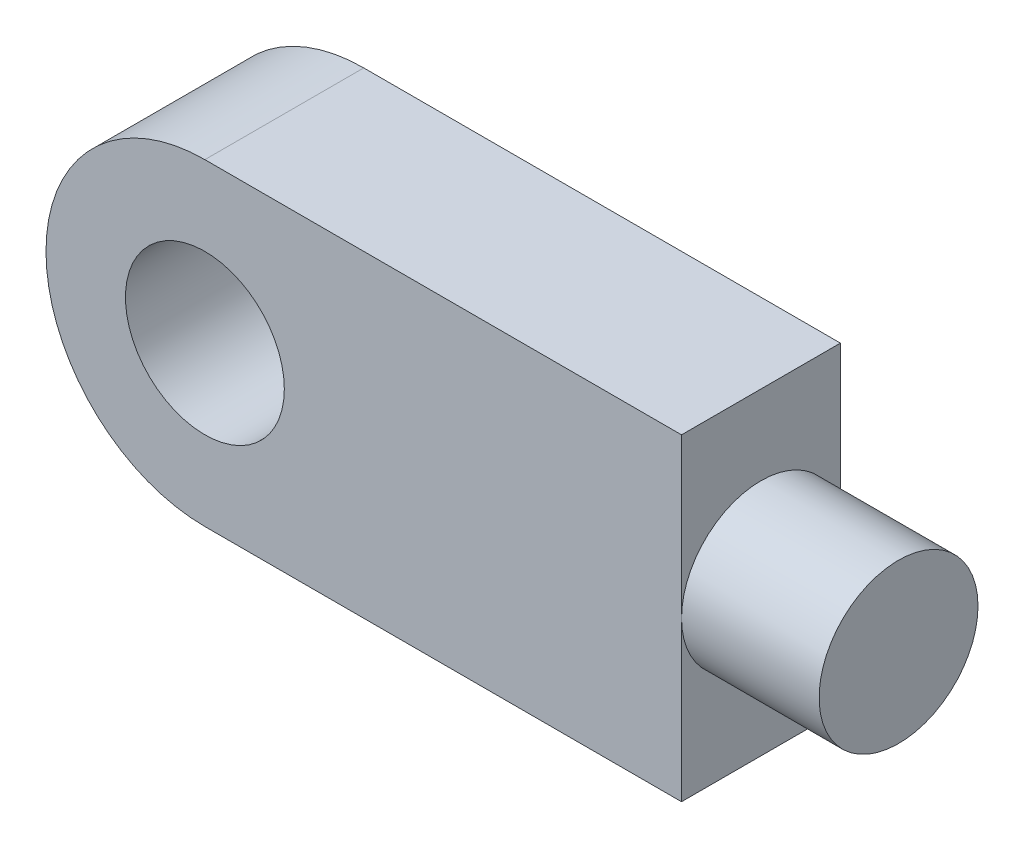
ISO-10303-21;
HEADER;
FILE_DESCRIPTION(('STEP AP214'),'2;1');
FILE_NAME('part.step','',(''),(''),'','','');
FILE_SCHEMA(('AUTOMOTIVE_DESIGN { 1 0 10303 214 1 1 1 1 }'));
ENDSEC;
DATA;
#1=APPLICATION_CONTEXT('core data for automotive mechanical design processes');
#2=APPLICATION_PROTOCOL_DEFINITION('international standard','automotive_design',2000,#1);
#3=PRODUCT_CONTEXT('',#1,'mechanical');
#4=PRODUCT('Part','Part','',(#3));
#5=PRODUCT_RELATED_PRODUCT_CATEGORY('part','',(#4));
#6=PRODUCT_DEFINITION_FORMATION('','',#4);
#7=PRODUCT_DEFINITION_CONTEXT('part definition',#1,'design');
#8=PRODUCT_DEFINITION('design','',#6,#7);
#9=PRODUCT_DEFINITION_SHAPE('','',#8);
#10=(LENGTH_UNIT() NAMED_UNIT(*) SI_UNIT(.MILLI.,.METRE.));
#11=(NAMED_UNIT(*) PLANE_ANGLE_UNIT() SI_UNIT($,.RADIAN.));
#12=(NAMED_UNIT(*) SI_UNIT($,.STERADIAN.) SOLID_ANGLE_UNIT());
#13=UNCERTAINTY_MEASURE_WITH_UNIT(LENGTH_MEASURE(1.E-05),#10,'distance_accuracy_value','');
#14=(GEOMETRIC_REPRESENTATION_CONTEXT(3) GLOBAL_UNCERTAINTY_ASSIGNED_CONTEXT((#13)) GLOBAL_UNIT_ASSIGNED_CONTEXT((#10,
#11,#12)) REPRESENTATION_CONTEXT('',''));
#15=CARTESIAN_POINT('',(0.,0.,0.));
#16=DIRECTION('',(0.,0.,1.));
#17=DIRECTION('',(1.,0.,0.));
#18=AXIS2_PLACEMENT_3D('',#15,#16,#17);
#19=CARTESIAN_POINT('',(125.,0.,0.));
#20=DIRECTION('',(-1.,0.,0.));
#21=DIRECTION('',(0.,0.,1.));
#22=AXIS2_PLACEMENT_3D('',#19,#20,#21);
#23=CYLINDRICAL_SURFACE('',#22,25.);
#24=CARTESIAN_POINT('',(75.,0.,0.));
#25=DIRECTION('',(1.,0.,0.));
#26=DIRECTION('',(0.,0.,-1.));
#27=AXIS2_PLACEMENT_3D('',#24,#25,#26);
#28=CIRCLE('',#27,25.);
#29=CARTESIAN_POINT('',(75.,0.,-25.));
#30=VERTEX_POINT('',#29);
#31=CARTESIAN_POINT('',(75.,0.,25.));
#32=VERTEX_POINT('',#31);
#33=EDGE_CURVE('E145',#30,#32,#28,.T.);
#34=ORIENTED_EDGE('',*,*,#33,.T.);
#35=CARTESIAN_POINT('',(75.,0.,0.));
#36=DIRECTION('',(1.,0.,0.));
#37=DIRECTION('',(0.,0.,-1.));
#38=AXIS2_PLACEMENT_3D('',#35,#36,#37);
#39=CIRCLE('',#38,25.);
#40=EDGE_CURVE('E161',#32,#30,#39,.T.);
#41=ORIENTED_EDGE('',*,*,#40,.T.);
#42=EDGE_LOOP('',(#34,#41));
#43=FACE_BOUND('',#42,.T.);
#44=CARTESIAN_POINT('',(118.301270189222,0.,0.));
#45=DIRECTION('',(1.,0.,0.));
#46=DIRECTION('',(0.,0.,-1.));
#47=AXIS2_PLACEMENT_3D('',#44,#45,#46);
#48=CIRCLE('',#47,25.);
#49=CARTESIAN_POINT('',(118.301270189222,0.,-25.));
#50=VERTEX_POINT('',#49);
#51=EDGE_CURVE('E163',#50,#50,#48,.F.);
#52=ORIENTED_EDGE('',*,*,#51,.T.);
#53=EDGE_LOOP('',(#52));
#54=FACE_BOUND('',#53,.T.);
#55=ADVANCED_FACE('F63',(#43,#54),#23,.T.);
#56=CARTESIAN_POINT('',(-75.,0.,25.));
#57=DIRECTION('',(0.,0.,1.));
#58=DIRECTION('',(1.,0.,0.));
#59=AXIS2_PLACEMENT_3D('',#56,#57,#58);
#60=PLANE('',#59);
#61=CARTESIAN_POINT('',(-75.,0.,25.));
#62=DIRECTION('',(0.,0.,1.));
#63=DIRECTION('',(1.,0.,0.));
#64=AXIS2_PLACEMENT_3D('',#61,#62,#63);
#65=CIRCLE('',#64,25.);
#66=CARTESIAN_POINT('',(-50.,0.,25.));
#67=VERTEX_POINT('',#66);
#68=EDGE_CURVE('E119',#67,#67,#65,.T.);
#69=ORIENTED_EDGE('',*,*,#68,.F.);
#70=EDGE_LOOP('',(#69));
#71=FACE_BOUND('',#70,.T.);
#72=DIRECTION('',(1.,0.,0.));
#73=VECTOR('',#72,1.);
#74=CARTESIAN_POINT('',(-75.,-50.,25.));
#75=LINE('',#74,#73);
#76=CARTESIAN_POINT('',(-75.,-50.,25.));
#77=VERTEX_POINT('',#76);
#78=CARTESIAN_POINT('',(75.,-50.,25.));
#79=VERTEX_POINT('',#78);
#80=EDGE_CURVE('E148',#77,#79,#75,.T.);
#81=ORIENTED_EDGE('',*,*,#80,.T.);
#82=DIRECTION('',(0.,-1.,0.));
#83=VECTOR('',#82,1.);
#84=CARTESIAN_POINT('',(75.,0.,25.));
#85=LINE('',#84,#83);
#86=EDGE_CURVE('E141',#32,#79,#85,.T.);
#87=ORIENTED_EDGE('',*,*,#86,.F.);
#88=DIRECTION('',(0.,-1.,0.));
#89=VECTOR('',#88,1.);
#90=CARTESIAN_POINT('',(75.,0.,25.));
#91=LINE('',#90,#89);
#92=CARTESIAN_POINT('',(75.,50.,25.));
#93=VERTEX_POINT('',#92);
#94=EDGE_CURVE('E153',#93,#32,#91,.T.);
#95=ORIENTED_EDGE('',*,*,#94,.F.);
#96=DIRECTION('',(-1.,0.,0.));
#97=VECTOR('',#96,1.);
#98=CARTESIAN_POINT('',(-75.,50.,25.));
#99=LINE('',#98,#97);
#100=CARTESIAN_POINT('',(-75.,50.,25.));
#101=VERTEX_POINT('',#100);
#102=EDGE_CURVE('E80',#93,#101,#99,.T.);
#103=ORIENTED_EDGE('',*,*,#102,.T.);
#104=CARTESIAN_POINT('',(-75.,0.,25.));
#105=DIRECTION('',(0.,0.,1.));
#106=DIRECTION('',(1.,0.,0.));
#107=AXIS2_PLACEMENT_3D('',#104,#105,#106);
#108=CIRCLE('',#107,50.);
#109=EDGE_CURVE('E108',#101,#77,#108,.T.);
#110=ORIENTED_EDGE('',*,*,#109,.T.);
#111=EDGE_LOOP('',(#81,#87,#95,#103,#110));
#112=FACE_BOUND('',#111,.T.);
#113=ADVANCED_FACE('F149',(#71,#112),#60,.T.);
#114=CARTESIAN_POINT('',(-75.,0.,-25.));
#115=DIRECTION('',(0.,0.,1.));
#116=DIRECTION('',(1.,0.,0.));
#117=AXIS2_PLACEMENT_3D('',#114,#115,#116);
#118=PLANE('',#117);
#119=CARTESIAN_POINT('',(-75.,0.,-25.));
#120=DIRECTION('',(0.,0.,1.));
#121=DIRECTION('',(1.,0.,0.));
#122=AXIS2_PLACEMENT_3D('',#119,#120,#121);
#123=CIRCLE('',#122,25.);
#124=CARTESIAN_POINT('',(-50.,0.,-25.));
#125=VERTEX_POINT('',#124);
#126=EDGE_CURVE('E123',#125,#125,#123,.T.);
#127=ORIENTED_EDGE('',*,*,#126,.T.);
#128=EDGE_LOOP('',(#127));
#129=FACE_BOUND('',#128,.T.);
#130=DIRECTION('',(0.,-1.,0.));
#131=VECTOR('',#130,1.);
#132=CARTESIAN_POINT('',(75.,0.,-25.));
#133=LINE('',#132,#131);
#134=CARTESIAN_POINT('',(75.,-50.,-25.));
#135=VERTEX_POINT('',#134);
#136=EDGE_CURVE('E137',#30,#135,#133,.T.);
#137=ORIENTED_EDGE('',*,*,#136,.T.);
#138=DIRECTION('',(1.,0.,0.));
#139=VECTOR('',#138,1.);
#140=CARTESIAN_POINT('',(-75.,-50.,-25.));
#141=LINE('',#140,#139);
#142=CARTESIAN_POINT('',(-75.,-50.,-25.));
#143=VERTEX_POINT('',#142);
#144=EDGE_CURVE('E109',#143,#135,#141,.T.);
#145=ORIENTED_EDGE('',*,*,#144,.F.);
#146=CARTESIAN_POINT('',(-75.,0.,-25.));
#147=DIRECTION('',(0.,0.,1.));
#148=DIRECTION('',(1.,0.,0.));
#149=AXIS2_PLACEMENT_3D('',#146,#147,#148);
#150=CIRCLE('',#149,50.);
#151=CARTESIAN_POINT('',(-75.,50.,-25.));
#152=VERTEX_POINT('',#151);
#153=EDGE_CURVE('E114',#152,#143,#150,.T.);
#154=ORIENTED_EDGE('',*,*,#153,.F.);
#155=DIRECTION('',(-1.,0.,0.));
#156=VECTOR('',#155,1.);
#157=CARTESIAN_POINT('',(-75.,50.,-25.));
#158=LINE('',#157,#156);
#159=CARTESIAN_POINT('',(75.,50.,-25.));
#160=VERTEX_POINT('',#159);
#161=EDGE_CURVE('E100',#160,#152,#158,.T.);
#162=ORIENTED_EDGE('',*,*,#161,.F.);
#163=DIRECTION('',(0.,-1.,0.));
#164=VECTOR('',#163,1.);
#165=CARTESIAN_POINT('',(75.,0.,-25.));
#166=LINE('',#165,#164);
#167=EDGE_CURVE('E95',#160,#30,#166,.T.);
#168=ORIENTED_EDGE('',*,*,#167,.T.);
#169=EDGE_LOOP('',(#137,#145,#154,#162,#168));
#170=FACE_BOUND('',#169,.T.);
#171=ADVANCED_FACE('F117',(#129,#170),#118,.F.);
#172=CARTESIAN_POINT('',(-75.,0.,25.));
#173=DIRECTION('',(0.,0.,-1.));
#174=DIRECTION('',(-1.,0.,0.));
#175=AXIS2_PLACEMENT_3D('',#172,#173,#174);
#176=CYLINDRICAL_SURFACE('',#175,50.);
#177=ORIENTED_EDGE('',*,*,#153,.T.);
#178=DIRECTION('',(0.,0.,-1.));
#179=VECTOR('',#178,1.);
#180=CARTESIAN_POINT('',(-75.,-50.,25.));
#181=LINE('',#180,#179);
#182=EDGE_CURVE('E12',#77,#143,#181,.T.);
#183=ORIENTED_EDGE('',*,*,#182,.F.);
#184=ORIENTED_EDGE('',*,*,#109,.F.);
#185=DIRECTION('',(0.,0.,-1.));
#186=VECTOR('',#185,1.);
#187=CARTESIAN_POINT('',(-75.,50.,25.));
#188=LINE('',#187,#186);
#189=EDGE_CURVE('E103',#101,#152,#188,.T.);
#190=ORIENTED_EDGE('',*,*,#189,.T.);
#191=EDGE_LOOP('',(#177,#183,#184,#190));
#192=FACE_BOUND('',#191,.T.);
#193=ADVANCED_FACE('F65',(#192),#176,.T.);
#194=CARTESIAN_POINT('',(-75.,-50.,25.));
#195=DIRECTION('',(0.,1.,0.));
#196=DIRECTION('',(-1.,0.,0.));
#197=AXIS2_PLACEMENT_3D('',#194,#195,#196);
#198=PLANE('',#197);
#199=ORIENTED_EDGE('',*,*,#144,.T.);
#200=DIRECTION('',(0.,0.,-1.));
#201=VECTOR('',#200,1.);
#202=CARTESIAN_POINT('',(75.,-50.,25.));
#203=LINE('',#202,#201);
#204=EDGE_CURVE('E72',#79,#135,#203,.T.);
#205=ORIENTED_EDGE('',*,*,#204,.F.);
#206=ORIENTED_EDGE('',*,*,#80,.F.);
#207=ORIENTED_EDGE('',*,*,#182,.T.);
#208=EDGE_LOOP('',(#199,#205,#206,#207));
#209=FACE_BOUND('',#208,.T.);
#210=ADVANCED_FACE('F147',(#209),#198,.F.);
#211=CARTESIAN_POINT('',(-75.,50.,25.));
#212=DIRECTION('',(0.,-1.,0.));
#213=DIRECTION('',(1.,0.,0.));
#214=AXIS2_PLACEMENT_3D('',#211,#212,#213);
#215=PLANE('',#214);
#216=ORIENTED_EDGE('',*,*,#161,.T.);
#217=ORIENTED_EDGE('',*,*,#189,.F.);
#218=ORIENTED_EDGE('',*,*,#102,.F.);
#219=DIRECTION('',(0.,0.,-1.));
#220=VECTOR('',#219,1.);
#221=CARTESIAN_POINT('',(75.,50.,25.));
#222=LINE('',#221,#220);
#223=EDGE_CURVE('E105',#93,#160,#222,.T.);
#224=ORIENTED_EDGE('',*,*,#223,.T.);
#225=EDGE_LOOP('',(#216,#217,#218,#224));
#226=FACE_BOUND('',#225,.T.);
#227=ADVANCED_FACE('F102',(#226),#215,.F.);
#228=CARTESIAN_POINT('',(-75.,0.,25.));
#229=DIRECTION('',(0.,0.,-1.));
#230=DIRECTION('',(-1.,0.,0.));
#231=AXIS2_PLACEMENT_3D('',#228,#229,#230);
#232=CYLINDRICAL_SURFACE('',#231,25.);
#233=ORIENTED_EDGE('',*,*,#68,.T.);
#234=EDGE_LOOP('',(#233));
#235=FACE_BOUND('',#234,.T.);
#236=ORIENTED_EDGE('',*,*,#126,.F.);
#237=EDGE_LOOP('',(#236));
#238=FACE_BOUND('',#237,.T.);
#239=ADVANCED_FACE('F186',(#235,#238),#232,.F.);
#240=CARTESIAN_POINT('',(75.,0.,0.));
#241=DIRECTION('',(1.,0.,0.));
#242=DIRECTION('',(0.,0.,-1.));
#243=AXIS2_PLACEMENT_3D('',#240,#241,#242);
#244=PLANE('',#243);
#245=ORIENTED_EDGE('',*,*,#33,.F.);
#246=ORIENTED_EDGE('',*,*,#167,.F.);
#247=ORIENTED_EDGE('',*,*,#223,.F.);
#248=ORIENTED_EDGE('',*,*,#94,.T.);
#249=EDGE_LOOP('',(#245,#246,#247,#248));
#250=FACE_BOUND('',#249,.T.);
#251=ADVANCED_FACE('F174',(#250),#244,.T.);
#252=CARTESIAN_POINT('',(75.,0.,0.));
#253=DIRECTION('',(1.,0.,0.));
#254=DIRECTION('',(0.,0.,-1.));
#255=AXIS2_PLACEMENT_3D('',#252,#253,#254);
#256=PLANE('',#255);
#257=ORIENTED_EDGE('',*,*,#40,.F.);
#258=ORIENTED_EDGE('',*,*,#86,.T.);
#259=ORIENTED_EDGE('',*,*,#204,.T.);
#260=ORIENTED_EDGE('',*,*,#136,.F.);
#261=EDGE_LOOP('',(#257,#258,#259,#260));
#262=FACE_BOUND('',#261,.T.);
#263=ADVANCED_FACE('F135',(#262),#256,.T.);
#264=CARTESIAN_POINT('',(118.301270189222,25.,25.001));
#265=DIRECTION('',(1.,0.,0.));
#266=DIRECTION('',(0.,0.,-1.));
#267=AXIS2_PLACEMENT_3D('',#264,#265,#266);
#268=PLANE('',#267);
#269=ORIENTED_EDGE('',*,*,#51,.F.);
#270=EDGE_LOOP('',(#269));
#271=FACE_BOUND('',#270,.T.);
#272=ADVANCED_FACE('F168',(#271),#268,.T.);
#273=CLOSED_SHELL('',(#55,#113,#171,#193,#210,#227,#239,#251,#263,#272));
#274=MANIFOLD_SOLID_BREP('B2',#273);
#275=ADVANCED_BREP_SHAPE_REPRESENTATION('',(#18,#274),#14);
#276=SHAPE_DEFINITION_REPRESENTATION(#9,#275);
ENDSEC;
END-ISO-10303-21;
